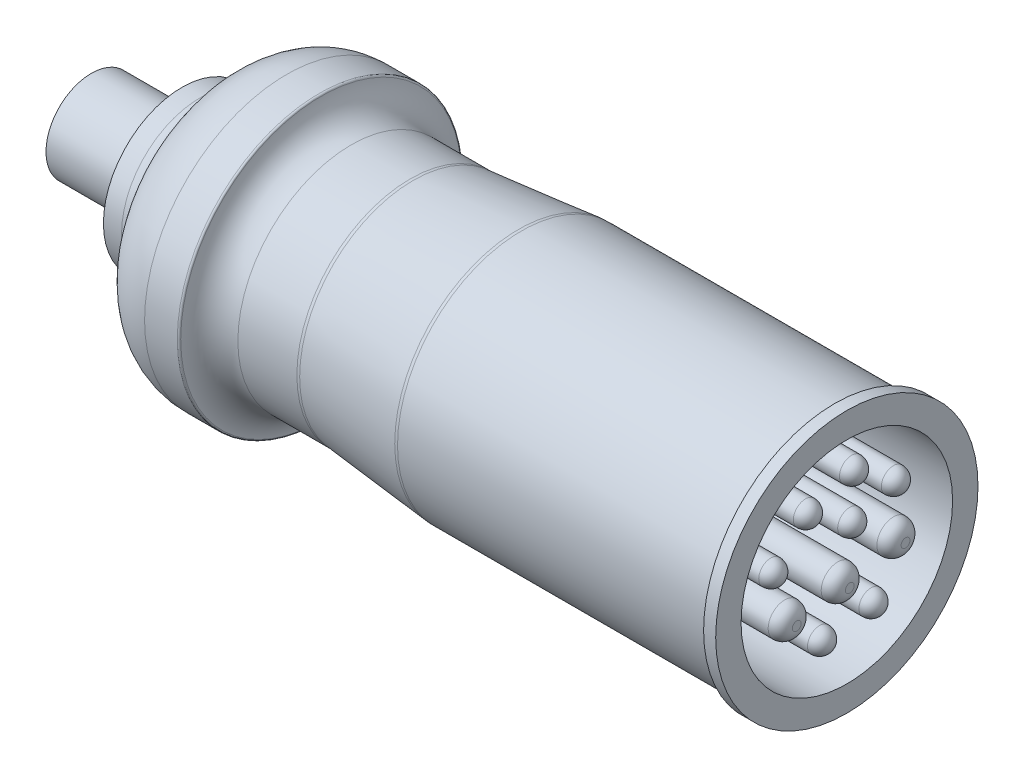
ISO-10303-21;
HEADER;
FILE_DESCRIPTION(('STEP AP214'),'2;1');
FILE_NAME('part.step','',(''),(''),'','','');
FILE_SCHEMA(('AUTOMOTIVE_DESIGN { 1 0 10303 214 1 1 1 1 }'));
ENDSEC;
DATA;
#1=APPLICATION_CONTEXT('core data for automotive mechanical design processes');
#2=APPLICATION_PROTOCOL_DEFINITION('international standard','automotive_design',2000,#1);
#3=PRODUCT_CONTEXT('',#1,'mechanical');
#4=PRODUCT('Part','Part','',(#3));
#5=PRODUCT_RELATED_PRODUCT_CATEGORY('part','',(#4));
#6=PRODUCT_DEFINITION_FORMATION('','',#4);
#7=PRODUCT_DEFINITION_CONTEXT('part definition',#1,'design');
#8=PRODUCT_DEFINITION('design','',#6,#7);
#9=PRODUCT_DEFINITION_SHAPE('','',#8);
#10=(LENGTH_UNIT() NAMED_UNIT(*) SI_UNIT(.MILLI.,.METRE.));
#11=(NAMED_UNIT(*) PLANE_ANGLE_UNIT() SI_UNIT($,.RADIAN.));
#12=(NAMED_UNIT(*) SI_UNIT($,.STERADIAN.) SOLID_ANGLE_UNIT());
#13=UNCERTAINTY_MEASURE_WITH_UNIT(LENGTH_MEASURE(1.E-05),#10,'distance_accuracy_value','');
#14=(GEOMETRIC_REPRESENTATION_CONTEXT(3) GLOBAL_UNCERTAINTY_ASSIGNED_CONTEXT((#13)) GLOBAL_UNIT_ASSIGNED_CONTEXT((#10,
#11,#12)) REPRESENTATION_CONTEXT('',''));
#15=CARTESIAN_POINT('',(0.,0.,0.));
#16=DIRECTION('',(0.,0.,1.));
#17=DIRECTION('',(1.,0.,0.));
#18=AXIS2_PLACEMENT_3D('',#15,#16,#17);
#19=CARTESIAN_POINT('',(0.,0.,0.));
#20=DIRECTION('',(-1.,0.,0.));
#21=DIRECTION('',(0.,0.,1.));
#22=AXIS2_PLACEMENT_3D('',#19,#20,#21);
#23=CYLINDRICAL_SURFACE('',#22,20.5);
#24=CARTESIAN_POINT('',(11.1583612134992,0.,0.));
#25=DIRECTION('',(1.,0.,0.));
#26=DIRECTION('',(0.,0.,-1.));
#27=AXIS2_PLACEMENT_3D('',#24,#25,#26);
#28=CIRCLE('',#27,20.5);
#29=CARTESIAN_POINT('',(11.1583612134992,0.,-20.5));
#30=VERTEX_POINT('',#29);
#31=EDGE_CURVE('E116',#30,#30,#28,.T.);
#32=ORIENTED_EDGE('',*,*,#31,.T.);
#33=EDGE_LOOP('',(#32));
#34=FACE_BOUND('',#33,.T.);
#35=CARTESIAN_POINT('',(63.,0.,0.));
#36=DIRECTION('',(1.,0.,0.));
#37=DIRECTION('',(0.,0.,-1.));
#38=AXIS2_PLACEMENT_3D('',#35,#36,#37);
#39=CIRCLE('',#38,20.5);
#40=CARTESIAN_POINT('',(63.,0.,-20.5));
#41=VERTEX_POINT('',#40);
#42=EDGE_CURVE('E46',#41,#41,#39,.T.);
#43=ORIENTED_EDGE('',*,*,#42,.F.);
#44=EDGE_LOOP('',(#43));
#45=FACE_BOUND('',#44,.T.);
#46=ADVANCED_FACE('F39',(#34,#45),#23,.T.);
#47=CARTESIAN_POINT('',(-45.,13.,0.));
#48=DIRECTION('',(1.,0.,0.));
#49=DIRECTION('',(0.,0.,-1.));
#50=AXIS2_PLACEMENT_3D('',#47,#48,#49);
#51=PLANE('',#50);
#52=CARTESIAN_POINT('',(-45.,0.,0.));
#53=DIRECTION('',(1.,0.,0.));
#54=DIRECTION('',(0.,0.,-1.));
#55=AXIS2_PLACEMENT_3D('',#52,#53,#54);
#56=CIRCLE('',#55,7.5);
#57=CARTESIAN_POINT('',(-45.,0.,-7.5));
#58=VERTEX_POINT('',#57);
#59=EDGE_CURVE('E11',#58,#58,#56,.F.);
#60=ORIENTED_EDGE('',*,*,#59,.F.);
#61=EDGE_LOOP('',(#60));
#62=FACE_BOUND('',#61,.T.);
#63=CARTESIAN_POINT('',(-45.,0.,0.));
#64=DIRECTION('',(-1.,0.,0.));
#65=DIRECTION('',(0.,0.,1.));
#66=AXIS2_PLACEMENT_3D('',#63,#64,#65);
#67=CIRCLE('',#66,13.);
#68=CARTESIAN_POINT('',(-45.,0.,13.));
#69=VERTEX_POINT('',#68);
#70=EDGE_CURVE('E134',#69,#69,#67,.T.);
#71=ORIENTED_EDGE('',*,*,#70,.T.);
#72=EDGE_LOOP('',(#71));
#73=FACE_BOUND('',#72,.T.);
#74=ADVANCED_FACE('F218',(#62,#73),#51,.F.);
#75=CARTESIAN_POINT('',(0.,0.,0.));
#76=DIRECTION('',(-1.,0.,0.));
#77=DIRECTION('',(0.,0.,1.));
#78=AXIS2_PLACEMENT_3D('',#75,#76,#77);
#79=CYLINDRICAL_SURFACE('',#78,13.);
#80=ORIENTED_EDGE('',*,*,#70,.F.);
#81=EDGE_LOOP('',(#80));
#82=FACE_BOUND('',#81,.T.);
#83=CARTESIAN_POINT('',(-42.,0.,0.));
#84=DIRECTION('',(-1.,0.,0.));
#85=DIRECTION('',(0.,0.,1.));
#86=AXIS2_PLACEMENT_3D('',#83,#84,#85);
#87=CIRCLE('',#86,13.);
#88=CARTESIAN_POINT('',(-42.,0.,13.));
#89=VERTEX_POINT('',#88);
#90=EDGE_CURVE('E137',#89,#89,#87,.T.);
#91=ORIENTED_EDGE('',*,*,#90,.T.);
#92=EDGE_LOOP('',(#91));
#93=FACE_BOUND('',#92,.T.);
#94=ADVANCED_FACE('F224',(#82,#93),#79,.T.);
#95=CARTESIAN_POINT('',(-42.,0.,0.));
#96=DIRECTION('',(-1.,0.,0.));
#97=DIRECTION('',(0.,0.,1.));
#98=AXIS2_PLACEMENT_3D('',#95,#96,#97);
#99=TOROIDAL_SURFACE('',#98,17.,4.);
#100=ORIENTED_EDGE('',*,*,#90,.F.);
#101=EDGE_LOOP('',(#100));
#102=FACE_BOUND('',#101,.T.);
#103=CARTESIAN_POINT('',(-38.1842431943322,0.,0.));
#104=DIRECTION('',(-1.,0.,0.));
#105=DIRECTION('',(0.,0.,1.));
#106=AXIS2_PLACEMENT_3D('',#103,#104,#105);
#107=CIRCLE('',#106,15.8);
#108=CARTESIAN_POINT('',(-38.1842431943322,0.,15.8));
#109=VERTEX_POINT('',#108);
#110=EDGE_CURVE('E140',#109,#109,#107,.T.);
#111=ORIENTED_EDGE('',*,*,#110,.T.);
#112=EDGE_LOOP('',(#111));
#113=FACE_BOUND('',#112,.T.);
#114=ADVANCED_FACE('F248',(#102,#113),#99,.F.);
#115=CARTESIAN_POINT('',(-27.6909119787458,0.,0.));
#116=DIRECTION('',(-1.,0.,0.));
#117=DIRECTION('',(0.,0.,1.));
#118=AXIS2_PLACEMENT_3D('',#115,#116,#117);
#119=TOROIDAL_SURFACE('',#118,12.5,11.);
#120=ORIENTED_EDGE('',*,*,#110,.F.);
#121=EDGE_LOOP('',(#120));
#122=FACE_BOUND('',#121,.T.);
#123=CARTESIAN_POINT('',(-27.6909119787458,0.,0.));
#124=DIRECTION('',(-1.,0.,0.));
#125=DIRECTION('',(0.,0.,1.));
#126=AXIS2_PLACEMENT_3D('',#123,#124,#125);
#127=CIRCLE('',#126,23.5);
#128=CARTESIAN_POINT('',(-27.6909119787458,0.,23.5));
#129=VERTEX_POINT('',#128);
#130=EDGE_CURVE('E143',#129,#129,#127,.T.);
#131=ORIENTED_EDGE('',*,*,#130,.T.);
#132=EDGE_LOOP('',(#131));
#133=FACE_BOUND('',#132,.T.);
#134=ADVANCED_FACE('F244',(#122,#133),#119,.T.);
#135=CARTESIAN_POINT('',(0.,0.,0.));
#136=DIRECTION('',(-1.,0.,0.));
#137=DIRECTION('',(0.,0.,1.));
#138=AXIS2_PLACEMENT_3D('',#135,#136,#137);
#139=CYLINDRICAL_SURFACE('',#138,23.5);
#140=CARTESIAN_POINT('',(-22.2776389283821,0.,0.));
#141=DIRECTION('',(1.,0.,0.));
#142=DIRECTION('',(0.,0.,-1.));
#143=AXIS2_PLACEMENT_3D('',#140,#141,#142);
#144=CIRCLE('',#143,23.5);
#145=CARTESIAN_POINT('',(-22.2776389283821,0.,-23.5));
#146=VERTEX_POINT('',#145);
#147=EDGE_CURVE('E128',#146,#146,#144,.F.);
#148=ORIENTED_EDGE('',*,*,#147,.T.);
#149=EDGE_LOOP('',(#148));
#150=FACE_BOUND('',#149,.T.);
#151=ORIENTED_EDGE('',*,*,#130,.F.);
#152=EDGE_LOOP('',(#151));
#153=FACE_BOUND('',#152,.T.);
#154=ADVANCED_FACE('F240',(#150,#153),#139,.T.);
#155=CARTESIAN_POINT('',(0.,0.,0.));
#156=DIRECTION('',(-1.,0.,0.));
#157=DIRECTION('',(0.,0.,1.));
#158=AXIS2_PLACEMENT_3D('',#155,#156,#157);
#159=CYLINDRICAL_SURFACE('',#158,18.75);
#160=CARTESIAN_POINT('',(-7.24363263615247,0.,0.));
#161=DIRECTION('',(-1.,0.,0.));
#162=DIRECTION('',(0.,0.,1.));
#163=AXIS2_PLACEMENT_3D('',#160,#161,#162);
#164=CIRCLE('',#163,18.75);
#165=CARTESIAN_POINT('',(-7.24363263615247,0.,18.75));
#166=VERTEX_POINT('',#165);
#167=EDGE_CURVE('E113',#166,#166,#164,.T.);
#168=ORIENTED_EDGE('',*,*,#167,.T.);
#169=EDGE_LOOP('',(#168));
#170=FACE_BOUND('',#169,.T.);
#171=CARTESIAN_POINT('',(-17.0062539111405,0.,0.));
#172=DIRECTION('',(-1.,0.,0.));
#173=DIRECTION('',(0.,0.,1.));
#174=AXIS2_PLACEMENT_3D('',#171,#172,#173);
#175=CIRCLE('',#174,18.75);
#176=CARTESIAN_POINT('',(-17.0062539111405,0.,18.75));
#177=VERTEX_POINT('',#176);
#178=EDGE_CURVE('E131',#177,#177,#175,.F.);
#179=ORIENTED_EDGE('',*,*,#178,.T.);
#180=EDGE_LOOP('',(#179));
#181=FACE_BOUND('',#180,.T.);
#182=ADVANCED_FACE('F236',(#170,#181),#159,.T.);
#183=CARTESIAN_POINT('',(10.9147285773466,0.,0.));
#184=DIRECTION('',(1.,0.,0.));
#185=DIRECTION('',(0.,0.,-1.));
#186=AXIS2_PLACEMENT_3D('',#183,#184,#185);
#187=CONICAL_SURFACE('',#186,20.5,0.0973760373811173);
#188=CARTESIAN_POINT('',(10.6722501023881,0.,0.));
#189=DIRECTION('',(-1.,0.,0.));
#190=DIRECTION('',(0.,0.,1.));
#191=AXIS2_PLACEMENT_3D('',#188,#189,#190);
#192=CIRCLE('',#191,20.4763134937074);
#193=CARTESIAN_POINT('',(10.6722501023881,0.,20.4763134937074));
#194=VERTEX_POINT('',#193);
#195=EDGE_CURVE('E119',#194,#194,#192,.T.);
#196=ORIENTED_EDGE('',*,*,#195,.T.);
#197=EDGE_LOOP('',(#196));
#198=FACE_BOUND('',#197,.T.);
#199=CARTESIAN_POINT('',(-6.75752152504136,0.,0.));
#200=DIRECTION('',(1.,0.,0.));
#201=DIRECTION('',(0.,0.,-1.));
#202=AXIS2_PLACEMENT_3D('',#199,#200,#201);
#203=CIRCLE('',#202,18.7736865062926);
#204=CARTESIAN_POINT('',(-6.75752152504136,0.,-18.7736865062926));
#205=VERTEX_POINT('',#204);
#206=EDGE_CURVE('E122',#205,#205,#203,.T.);
#207=ORIENTED_EDGE('',*,*,#206,.T.);
#208=EDGE_LOOP('',(#207));
#209=FACE_BOUND('',#208,.T.);
#210=ADVANCED_FACE('F232',(#198,#209),#187,.T.);
#211=CARTESIAN_POINT('',(-17.0062539111405,0.,0.));
#212=DIRECTION('',(-1.,0.,0.));
#213=DIRECTION('',(0.,0.,1.));
#214=AXIS2_PLACEMENT_3D('',#211,#212,#213);
#215=TOROIDAL_SURFACE('',#214,23.75,5.);
#216=CARTESIAN_POINT('',(-21.9792586443877,0.,0.));
#217=DIRECTION('',(1.,0.,0.));
#218=DIRECTION('',(0.,0.,-1.));
#219=AXIS2_PLACEMENT_3D('',#216,#217,#218);
#220=CIRCLE('',#219,23.2311320754717);
#221=CARTESIAN_POINT('',(-21.9792586443877,0.,-23.2311320754717));
#222=VERTEX_POINT('',#221);
#223=EDGE_CURVE('E125',#222,#222,#220,.T.);
#224=ORIENTED_EDGE('',*,*,#223,.T.);
#225=EDGE_LOOP('',(#224));
#226=FACE_BOUND('',#225,.T.);
#227=ORIENTED_EDGE('',*,*,#178,.F.);
#228=EDGE_LOOP('',(#227));
#229=FACE_BOUND('',#228,.T.);
#230=ADVANCED_FACE('F235',(#226,#229),#215,.F.);
#231=CARTESIAN_POINT('',(-22.2776389283821,0.,0.));
#232=DIRECTION('',(1.,0.,0.));
#233=DIRECTION('',(0.,0.,-1.));
#234=AXIS2_PLACEMENT_3D('',#231,#232,#233);
#235=TOROIDAL_SURFACE('',#234,23.2,0.3);
#236=ORIENTED_EDGE('',*,*,#223,.F.);
#237=EDGE_LOOP('',(#236));
#238=FACE_BOUND('',#237,.T.);
#239=ORIENTED_EDGE('',*,*,#147,.F.);
#240=EDGE_LOOP('',(#239));
#241=FACE_BOUND('',#240,.T.);
#242=ADVANCED_FACE('F258',(#238,#241),#235,.T.);
#243=CARTESIAN_POINT('',(11.1583612134992,0.,0.));
#244=DIRECTION('',(1.,0.,0.));
#245=DIRECTION('',(0.,0.,-1.));
#246=AXIS2_PLACEMENT_3D('',#243,#244,#245);
#247=TOROIDAL_SURFACE('',#246,15.5,5.);
#248=ORIENTED_EDGE('',*,*,#31,.F.);
#249=EDGE_LOOP('',(#248));
#250=FACE_BOUND('',#249,.T.);
#251=ORIENTED_EDGE('',*,*,#195,.F.);
#252=EDGE_LOOP('',(#251));
#253=FACE_BOUND('',#252,.T.);
#254=ADVANCED_FACE('F262',(#250,#253),#247,.T.);
#255=CARTESIAN_POINT('',(-7.24363263615247,0.,0.));
#256=DIRECTION('',(-1.,0.,0.));
#257=DIRECTION('',(0.,0.,1.));
#258=AXIS2_PLACEMENT_3D('',#255,#256,#257);
#259=TOROIDAL_SURFACE('',#258,23.75,5.);
#260=ORIENTED_EDGE('',*,*,#206,.F.);
#261=EDGE_LOOP('',(#260));
#262=FACE_BOUND('',#261,.T.);
#263=ORIENTED_EDGE('',*,*,#167,.F.);
#264=EDGE_LOOP('',(#263));
#265=FACE_BOUND('',#264,.T.);
#266=ADVANCED_FACE('F266',(#262,#265),#259,.F.);
#267=CARTESIAN_POINT('',(63.,0.,0.));
#268=DIRECTION('',(1.,0.,0.));
#269=DIRECTION('',(0.,0.,-1.));
#270=AXIS2_PLACEMENT_3D('',#267,#268,#269);
#271=CYLINDRICAL_SURFACE('',#270,21.7);
#272=CARTESIAN_POINT('',(63.,0.,0.));
#273=DIRECTION('',(1.,0.,0.));
#274=DIRECTION('',(0.,0.,-1.));
#275=AXIS2_PLACEMENT_3D('',#272,#273,#274);
#276=CIRCLE('',#275,21.7);
#277=CARTESIAN_POINT('',(63.,0.,-21.7));
#278=VERTEX_POINT('',#277);
#279=EDGE_CURVE('E182',#278,#278,#276,.T.);
#280=ORIENTED_EDGE('',*,*,#279,.T.);
#281=EDGE_LOOP('',(#280));
#282=FACE_BOUND('',#281,.T.);
#283=CARTESIAN_POINT('',(65.,0.,0.));
#284=DIRECTION('',(1.,0.,0.));
#285=DIRECTION('',(0.,0.,-1.));
#286=AXIS2_PLACEMENT_3D('',#283,#284,#285);
#287=CIRCLE('',#286,21.7);
#288=CARTESIAN_POINT('',(65.,0.,-21.7));
#289=VERTEX_POINT('',#288);
#290=EDGE_CURVE('E183',#289,#289,#287,.T.);
#291=ORIENTED_EDGE('',*,*,#290,.F.);
#292=EDGE_LOOP('',(#291));
#293=FACE_BOUND('',#292,.T.);
#294=ADVANCED_FACE('F270',(#282,#293),#271,.T.);
#295=CARTESIAN_POINT('',(63.,0.,0.));
#296=DIRECTION('',(1.,0.,0.));
#297=DIRECTION('',(0.,0.,-1.));
#298=AXIS2_PLACEMENT_3D('',#295,#296,#297);
#299=PLANE('',#298);
#300=ORIENTED_EDGE('',*,*,#42,.T.);
#301=EDGE_LOOP('',(#300));
#302=FACE_BOUND('',#301,.T.);
#303=ORIENTED_EDGE('',*,*,#279,.F.);
#304=EDGE_LOOP('',(#303));
#305=FACE_BOUND('',#304,.T.);
#306=ADVANCED_FACE('F339',(#302,#305),#299,.F.);
#307=CARTESIAN_POINT('',(65.,0.,0.));
#308=DIRECTION('',(-1.,0.,0.));
#309=DIRECTION('',(0.,0.,1.));
#310=AXIS2_PLACEMENT_3D('',#307,#308,#309);
#311=PLANE('',#310);
#312=CARTESIAN_POINT('',(65.,3.56731656131285,-2.48519986218187));
#313=DIRECTION('',(-1.,0.,0.));
#314=DIRECTION('',(0.,0.,1.));
#315=AXIS2_PLACEMENT_3D('',#312,#313,#314);
#316=CIRCLE('',#315,0.000606669885716993);
#317=CARTESIAN_POINT('',(65.,3.56731656131285,-2.48459319229615));
#318=VERTEX_POINT('',#317);
#319=EDGE_CURVE('E71',#318,#318,#316,.F.);
#320=ORIENTED_EDGE('',*,*,#319,.T.);
#321=EDGE_LOOP('',(#320));
#322=FACE_BOUND('',#321,.T.);
#323=ADVANCED_FACE('F345',(#322),#311,.F.);
#324=CARTESIAN_POINT('',(65.,0.,0.));
#325=DIRECTION('',(-1.,0.,0.));
#326=DIRECTION('',(0.,0.,1.));
#327=AXIS2_PLACEMENT_3D('',#324,#325,#326);
#328=PLANE('',#327);
#329=CARTESIAN_POINT('',(65.,10.8693952367516,-2.78447552930021));
#330=DIRECTION('',(-1.,0.,0.));
#331=DIRECTION('',(0.,0.,1.));
#332=AXIS2_PLACEMENT_3D('',#329,#330,#331);
#333=CIRCLE('',#332,0.000606669885715692);
#334=CARTESIAN_POINT('',(65.,10.8693952367516,-2.78386885941449));
#335=VERTEX_POINT('',#334);
#336=EDGE_CURVE('E59',#335,#335,#333,.F.);
#337=ORIENTED_EDGE('',*,*,#336,.T.);
#338=EDGE_LOOP('',(#337));
#339=FACE_BOUND('',#338,.T.);
#340=ADVANCED_FACE('F405',(#339),#328,.F.);
#341=CARTESIAN_POINT('',(65.,0.,0.));
#342=DIRECTION('',(-1.,0.,0.));
#343=DIRECTION('',(0.,0.,1.));
#344=AXIS2_PLACEMENT_3D('',#341,#342,#343);
#345=PLANE('',#344);
#346=CARTESIAN_POINT('',(65.,8.44417520421064,4.84394384578304));
#347=DIRECTION('',(-1.,0.,0.));
#348=DIRECTION('',(0.,0.,1.));
#349=AXIS2_PLACEMENT_3D('',#346,#347,#348);
#350=CIRCLE('',#349,0.000606669885717427);
#351=CARTESIAN_POINT('',(65.,8.44417520421064,4.84455051566875));
#352=VERTEX_POINT('',#351);
#353=EDGE_CURVE('E50',#352,#352,#350,.F.);
#354=ORIENTED_EDGE('',*,*,#353,.T.);
#355=EDGE_LOOP('',(#354));
#356=FACE_BOUND('',#355,.T.);
#357=ADVANCED_FACE('F398',(#356),#345,.F.);
#358=CARTESIAN_POINT('',(65.,0.,0.));
#359=DIRECTION('',(-1.,0.,0.));
#360=DIRECTION('',(0.,0.,1.));
#361=AXIS2_PLACEMENT_3D('',#358,#359,#360);
#362=PLANE('',#361);
#363=CARTESIAN_POINT('',(65.,2.84412167452525,10.5762821045161));
#364=DIRECTION('',(-1.,0.,0.));
#365=DIRECTION('',(0.,0.,1.));
#366=AXIS2_PLACEMENT_3D('',#363,#364,#365);
#367=CIRCLE('',#366,0.00060666988571656);
#368=CARTESIAN_POINT('',(65.,2.84412167452525,10.5768887744018));
#369=VERTEX_POINT('',#368);
#370=EDGE_CURVE('E77',#369,#369,#367,.F.);
#371=ORIENTED_EDGE('',*,*,#370,.T.);
#372=EDGE_LOOP('',(#371));
#373=FACE_BOUND('',#372,.T.);
#374=ADVANCED_FACE('F390',(#373),#362,.F.);
#375=CARTESIAN_POINT('',(65.,0.,0.));
#376=DIRECTION('',(-1.,0.,0.));
#377=DIRECTION('',(0.,0.,1.));
#378=AXIS2_PLACEMENT_3D('',#375,#376,#377);
#379=PLANE('',#378);
#380=CARTESIAN_POINT('',(65.,5.9307653523046,-9.70737634946245));
#381=DIRECTION('',(-1.,0.,0.));
#382=DIRECTION('',(0.,0.,1.));
#383=AXIS2_PLACEMENT_3D('',#380,#381,#382);
#384=CIRCLE('',#383,0.00060666988571656);
#385=CARTESIAN_POINT('',(65.,5.9307653523046,-9.70676967957674));
#386=VERTEX_POINT('',#385);
#387=EDGE_CURVE('E65',#386,#386,#384,.F.);
#388=ORIENTED_EDGE('',*,*,#387,.T.);
#389=EDGE_LOOP('',(#388));
#390=FACE_BOUND('',#389,.T.);
#391=ADVANCED_FACE('F382',(#390),#379,.F.);
#392=CARTESIAN_POINT('',(65.,0.,0.));
#393=DIRECTION('',(-1.,0.,0.));
#394=DIRECTION('',(0.,0.,1.));
#395=AXIS2_PLACEMENT_3D('',#392,#393,#394);
#396=PLANE('',#395);
#397=CARTESIAN_POINT('',(65.,-10.8693952367516,2.50691363260725));
#398=DIRECTION('',(-1.,0.,0.));
#399=DIRECTION('',(0.,0.,1.));
#400=AXIS2_PLACEMENT_3D('',#397,#398,#399);
#401=CIRCLE('',#400,0.000606669885717427);
#402=CARTESIAN_POINT('',(65.,-10.8693952367516,2.50752030249297));
#403=VERTEX_POINT('',#402);
#404=EDGE_CURVE('E107',#403,#403,#401,.F.);
#405=ORIENTED_EDGE('',*,*,#404,.T.);
#406=EDGE_LOOP('',(#405));
#407=FACE_BOUND('',#406,.T.);
#408=ADVANCED_FACE('F374',(#407),#396,.F.);
#409=CARTESIAN_POINT('',(65.,0.,0.));
#410=DIRECTION('',(-1.,0.,0.));
#411=DIRECTION('',(0.,0.,1.));
#412=AXIS2_PLACEMENT_3D('',#409,#410,#411);
#413=PLANE('',#412);
#414=CARTESIAN_POINT('',(65.,-9.72292758500494,-6.00340393612724));
#415=DIRECTION('',(-1.,0.,0.));
#416=DIRECTION('',(0.,0.,1.));
#417=AXIS2_PLACEMENT_3D('',#414,#415,#416);
#418=CIRCLE('',#417,0.000606669885717427);
#419=CARTESIAN_POINT('',(65.,-9.72292758500494,-6.00279726624152));
#420=VERTEX_POINT('',#419);
#421=EDGE_CURVE('E101',#420,#420,#418,.F.);
#422=ORIENTED_EDGE('',*,*,#421,.T.);
#423=EDGE_LOOP('',(#422));
#424=FACE_BOUND('',#423,.T.);
#425=ADVANCED_FACE('F366',(#424),#413,.F.);
#426=CARTESIAN_POINT('',(65.,0.,0.));
#427=DIRECTION('',(-1.,0.,0.));
#428=DIRECTION('',(0.,0.,1.));
#429=AXIS2_PLACEMENT_3D('',#426,#427,#428);
#430=PLANE('',#429);
#431=CARTESIAN_POINT('',(65.,-2.13860311960426,-9.70737634946245));
#432=DIRECTION('',(-1.,0.,0.));
#433=DIRECTION('',(0.,0.,1.));
#434=AXIS2_PLACEMENT_3D('',#431,#432,#433);
#435=CIRCLE('',#434,0.733173099565215);
#436=CARTESIAN_POINT('',(65.,-2.13860311960426,-8.97420324989724));
#437=VERTEX_POINT('',#436);
#438=EDGE_CURVE('E95',#437,#437,#435,.F.);
#439=ORIENTED_EDGE('',*,*,#438,.T.);
#440=EDGE_LOOP('',(#439));
#441=FACE_BOUND('',#440,.T.);
#442=ADVANCED_FACE('F358',(#441),#430,.F.);
#443=CARTESIAN_POINT('',(65.,0.,0.));
#444=DIRECTION('',(-1.,0.,0.));
#445=DIRECTION('',(0.,0.,1.));
#446=AXIS2_PLACEMENT_3D('',#443,#444,#445);
#447=PLANE('',#446);
#448=CARTESIAN_POINT('',(65.,-3.99058932627187,-0.491540225806979));
#449=DIRECTION('',(-1.,0.,0.));
#450=DIRECTION('',(0.,0.,1.));
#451=AXIS2_PLACEMENT_3D('',#448,#449,#450);
#452=CIRCLE('',#451,0.733173099565215);
#453=CARTESIAN_POINT('',(65.,-3.99058932627187,0.241632873758237));
#454=VERTEX_POINT('',#453);
#455=EDGE_CURVE('E89',#454,#454,#452,.F.);
#456=ORIENTED_EDGE('',*,*,#455,.T.);
#457=EDGE_LOOP('',(#456));
#458=FACE_BOUND('',#457,.T.);
#459=ADVANCED_FACE('F350',(#458),#447,.F.);
#460=CARTESIAN_POINT('',(65.,0.,0.));
#461=DIRECTION('',(-1.,0.,0.));
#462=DIRECTION('',(0.,0.,1.));
#463=AXIS2_PLACEMENT_3D('',#460,#461,#462);
#464=PLANE('',#463);
#465=CARTESIAN_POINT('',(65.,-5.04886715865336,8.28334680102288));
#466=DIRECTION('',(-1.,0.,0.));
#467=DIRECTION('',(0.,0.,1.));
#468=AXIS2_PLACEMENT_3D('',#465,#466,#467);
#469=CIRCLE('',#468,0.733173099565215);
#470=CARTESIAN_POINT('',(65.,-5.04886715865336,9.0165199005881));
#471=VERTEX_POINT('',#470);
#472=EDGE_CURVE('E83',#471,#471,#469,.F.);
#473=ORIENTED_EDGE('',*,*,#472,.T.);
#474=EDGE_LOOP('',(#473));
#475=FACE_BOUND('',#474,.T.);
#476=ADVANCED_FACE('F302',(#475),#464,.F.);
#477=CARTESIAN_POINT('',(63.,3.56731656131285,-2.48519986218187));
#478=DIRECTION('',(-1.,0.,0.));
#479=DIRECTION('',(0.,0.,1.));
#480=AXIS2_PLACEMENT_3D('',#477,#478,#479);
#481=DEGENERATE_TOROIDAL_SURFACE('',#480,0.000606669885716993,2.,.T.);
#482=ORIENTED_EDGE('',*,*,#319,.F.);
#483=EDGE_LOOP('',(#482));
#484=FACE_BOUND('',#483,.T.);
#485=CARTESIAN_POINT('',(63.,3.56731656131285,-2.48519986218187));
#486=DIRECTION('',(-1.,0.,0.));
#487=DIRECTION('',(0.,0.,1.));
#488=AXIS2_PLACEMENT_3D('',#485,#486,#487);
#489=CIRCLE('',#488,2.00060666988572);
#490=CARTESIAN_POINT('',(63.,3.56731656131285,-0.484593192296154));
#491=VERTEX_POINT('',#490);
#492=EDGE_CURVE('E74',#491,#491,#489,.T.);
#493=ORIENTED_EDGE('',*,*,#492,.F.);
#494=EDGE_LOOP('',(#493));
#495=FACE_BOUND('',#494,.T.);
#496=ADVANCED_FACE('F298',(#484,#495),#481,.T.);
#497=CARTESIAN_POINT('',(63.,10.8693952367516,-2.78447552930021));
#498=DIRECTION('',(-1.,0.,0.));
#499=DIRECTION('',(0.,0.,1.));
#500=AXIS2_PLACEMENT_3D('',#497,#498,#499);
#501=DEGENERATE_TOROIDAL_SURFACE('',#500,0.000606669885715692,2.,.T.);
#502=ORIENTED_EDGE('',*,*,#336,.F.);
#503=EDGE_LOOP('',(#502));
#504=FACE_BOUND('',#503,.T.);
#505=CARTESIAN_POINT('',(63.,10.8693952367516,-2.78447552930021));
#506=DIRECTION('',(-1.,0.,0.));
#507=DIRECTION('',(0.,0.,1.));
#508=AXIS2_PLACEMENT_3D('',#505,#506,#507);
#509=CIRCLE('',#508,2.00060666988572);
#510=CARTESIAN_POINT('',(63.,10.8693952367516,-0.783868859414489));
#511=VERTEX_POINT('',#510);
#512=EDGE_CURVE('E62',#511,#511,#509,.T.);
#513=ORIENTED_EDGE('',*,*,#512,.F.);
#514=EDGE_LOOP('',(#513));
#515=FACE_BOUND('',#514,.T.);
#516=ADVANCED_FACE('F301',(#504,#515),#501,.T.);
#517=CARTESIAN_POINT('',(63.,8.44417520421064,4.84394384578304));
#518=DIRECTION('',(-1.,0.,0.));
#519=DIRECTION('',(0.,0.,1.));
#520=AXIS2_PLACEMENT_3D('',#517,#518,#519);
#521=DEGENERATE_TOROIDAL_SURFACE('',#520,0.000606669885717427,2.,.T.);
#522=ORIENTED_EDGE('',*,*,#353,.F.);
#523=EDGE_LOOP('',(#522));
#524=FACE_BOUND('',#523,.T.);
#525=CARTESIAN_POINT('',(63.,8.44417520421064,4.84394384578304));
#526=DIRECTION('',(-1.,0.,0.));
#527=DIRECTION('',(0.,0.,1.));
#528=AXIS2_PLACEMENT_3D('',#525,#526,#527);
#529=CIRCLE('',#528,2.00060666988572);
#530=CARTESIAN_POINT('',(63.,8.44417520421064,6.84455051566875));
#531=VERTEX_POINT('',#530);
#532=EDGE_CURVE('E54',#531,#531,#529,.T.);
#533=ORIENTED_EDGE('',*,*,#532,.F.);
#534=EDGE_LOOP('',(#533));
#535=FACE_BOUND('',#534,.T.);
#536=ADVANCED_FACE('F41',(#524,#535),#521,.T.);
#537=CARTESIAN_POINT('',(63.,2.84412167452525,10.5762821045161));
#538=DIRECTION('',(-1.,0.,0.));
#539=DIRECTION('',(0.,0.,1.));
#540=AXIS2_PLACEMENT_3D('',#537,#538,#539);
#541=DEGENERATE_TOROIDAL_SURFACE('',#540,0.00060666988571656,2.,.T.);
#542=ORIENTED_EDGE('',*,*,#370,.F.);
#543=EDGE_LOOP('',(#542));
#544=FACE_BOUND('',#543,.T.);
#545=CARTESIAN_POINT('',(63.,2.84412167452525,10.5762821045161));
#546=DIRECTION('',(-1.,0.,0.));
#547=DIRECTION('',(0.,0.,1.));
#548=AXIS2_PLACEMENT_3D('',#545,#546,#547);
#549=CIRCLE('',#548,2.00060666988572);
#550=CARTESIAN_POINT('',(63.,2.84412167452525,12.5768887744018));
#551=VERTEX_POINT('',#550);
#552=EDGE_CURVE('E80',#551,#551,#549,.T.);
#553=ORIENTED_EDGE('',*,*,#552,.F.);
#554=EDGE_LOOP('',(#553));
#555=FACE_BOUND('',#554,.T.);
#556=ADVANCED_FACE('F294',(#544,#555),#541,.T.);
#557=CARTESIAN_POINT('',(63.,5.9307653523046,-9.70737634946245));
#558=DIRECTION('',(-1.,0.,0.));
#559=DIRECTION('',(0.,0.,1.));
#560=AXIS2_PLACEMENT_3D('',#557,#558,#559);
#561=DEGENERATE_TOROIDAL_SURFACE('',#560,0.00060666988571656,2.,.T.);
#562=ORIENTED_EDGE('',*,*,#387,.F.);
#563=EDGE_LOOP('',(#562));
#564=FACE_BOUND('',#563,.T.);
#565=CARTESIAN_POINT('',(63.,5.9307653523046,-9.70737634946245));
#566=DIRECTION('',(-1.,0.,0.));
#567=DIRECTION('',(0.,0.,1.));
#568=AXIS2_PLACEMENT_3D('',#565,#566,#567);
#569=CIRCLE('',#568,2.00060666988572);
#570=CARTESIAN_POINT('',(63.,5.9307653523046,-7.70676967957674));
#571=VERTEX_POINT('',#570);
#572=EDGE_CURVE('E68',#571,#571,#569,.T.);
#573=ORIENTED_EDGE('',*,*,#572,.F.);
#574=EDGE_LOOP('',(#573));
#575=FACE_BOUND('',#574,.T.);
#576=ADVANCED_FACE('F276',(#564,#575),#561,.T.);
#577=CARTESIAN_POINT('',(63.,-10.8693952367516,2.50691363260725));
#578=DIRECTION('',(-1.,0.,0.));
#579=DIRECTION('',(0.,0.,1.));
#580=AXIS2_PLACEMENT_3D('',#577,#578,#579);
#581=DEGENERATE_TOROIDAL_SURFACE('',#580,0.000606669885717427,2.,.T.);
#582=ORIENTED_EDGE('',*,*,#404,.F.);
#583=EDGE_LOOP('',(#582));
#584=FACE_BOUND('',#583,.T.);
#585=CARTESIAN_POINT('',(63.,-10.8693952367516,2.50691363260725));
#586=DIRECTION('',(-1.,0.,0.));
#587=DIRECTION('',(0.,0.,1.));
#588=AXIS2_PLACEMENT_3D('',#585,#586,#587);
#589=CIRCLE('',#588,2.00060666988572);
#590=CARTESIAN_POINT('',(63.,-10.8693952367516,4.50752030249297));
#591=VERTEX_POINT('',#590);
#592=EDGE_CURVE('E110',#591,#591,#589,.T.);
#593=ORIENTED_EDGE('',*,*,#592,.F.);
#594=EDGE_LOOP('',(#593));
#595=FACE_BOUND('',#594,.T.);
#596=ADVANCED_FACE('F272',(#584,#595),#581,.T.);
#597=CARTESIAN_POINT('',(63.,-9.72292758500494,-6.00340393612724));
#598=DIRECTION('',(-1.,0.,0.));
#599=DIRECTION('',(0.,0.,1.));
#600=AXIS2_PLACEMENT_3D('',#597,#598,#599);
#601=DEGENERATE_TOROIDAL_SURFACE('',#600,0.000606669885717427,2.,.T.);
#602=ORIENTED_EDGE('',*,*,#421,.F.);
#603=EDGE_LOOP('',(#602));
#604=FACE_BOUND('',#603,.T.);
#605=CARTESIAN_POINT('',(63.,-9.72292758500494,-6.00340393612724));
#606=DIRECTION('',(-1.,0.,0.));
#607=DIRECTION('',(0.,0.,1.));
#608=AXIS2_PLACEMENT_3D('',#605,#606,#607);
#609=CIRCLE('',#608,2.00060666988572);
#610=CARTESIAN_POINT('',(63.,-9.72292758500494,-4.00279726624152));
#611=VERTEX_POINT('',#610);
#612=EDGE_CURVE('E104',#611,#611,#609,.T.);
#613=ORIENTED_EDGE('',*,*,#612,.F.);
#614=EDGE_LOOP('',(#613));
#615=FACE_BOUND('',#614,.T.);
#616=ADVANCED_FACE('F275',(#604,#615),#601,.T.);
#617=CARTESIAN_POINT('',(63.,-2.13860311960426,-9.70737634946245));
#618=DIRECTION('',(-1.,0.,0.));
#619=DIRECTION('',(0.,0.,1.));
#620=AXIS2_PLACEMENT_3D('',#617,#618,#619);
#621=DEGENERATE_TOROIDAL_SURFACE('',#620,0.733173099565215,2.,.T.);
#622=ORIENTED_EDGE('',*,*,#438,.F.);
#623=EDGE_LOOP('',(#622));
#624=FACE_BOUND('',#623,.T.);
#625=CARTESIAN_POINT('',(63.,-2.13860311960426,-9.70737634946245));
#626=DIRECTION('',(-1.,0.,0.));
#627=DIRECTION('',(0.,0.,1.));
#628=AXIS2_PLACEMENT_3D('',#625,#626,#627);
#629=CIRCLE('',#628,2.73317309956522);
#630=CARTESIAN_POINT('',(63.,-2.13860311960426,-6.97420324989724));
#631=VERTEX_POINT('',#630);
#632=EDGE_CURVE('E98',#631,#631,#629,.T.);
#633=ORIENTED_EDGE('',*,*,#632,.F.);
#634=EDGE_LOOP('',(#633));
#635=FACE_BOUND('',#634,.T.);
#636=ADVANCED_FACE('F280',(#624,#635),#621,.T.);
#637=CARTESIAN_POINT('',(63.,-3.99058932627187,-0.491540225806979));
#638=DIRECTION('',(-1.,0.,0.));
#639=DIRECTION('',(0.,0.,1.));
#640=AXIS2_PLACEMENT_3D('',#637,#638,#639);
#641=DEGENERATE_TOROIDAL_SURFACE('',#640,0.733173099565215,2.,.T.);
#642=ORIENTED_EDGE('',*,*,#455,.F.);
#643=EDGE_LOOP('',(#642));
#644=FACE_BOUND('',#643,.T.);
#645=CARTESIAN_POINT('',(63.,-3.99058932627187,-0.491540225806979));
#646=DIRECTION('',(-1.,0.,0.));
#647=DIRECTION('',(0.,0.,1.));
#648=AXIS2_PLACEMENT_3D('',#645,#646,#647);
#649=CIRCLE('',#648,2.73317309956522);
#650=CARTESIAN_POINT('',(63.,-3.99058932627187,2.24163287375824));
#651=VERTEX_POINT('',#650);
#652=EDGE_CURVE('E92',#651,#651,#649,.T.);
#653=ORIENTED_EDGE('',*,*,#652,.F.);
#654=EDGE_LOOP('',(#653));
#655=FACE_BOUND('',#654,.T.);
#656=ADVANCED_FACE('F284',(#644,#655),#641,.T.);
#657=CARTESIAN_POINT('',(63.,-5.04886715865336,8.28334680102288));
#658=DIRECTION('',(-1.,0.,0.));
#659=DIRECTION('',(0.,0.,1.));
#660=AXIS2_PLACEMENT_3D('',#657,#658,#659);
#661=DEGENERATE_TOROIDAL_SURFACE('',#660,0.733173099565215,2.,.T.);
#662=ORIENTED_EDGE('',*,*,#472,.F.);
#663=EDGE_LOOP('',(#662));
#664=FACE_BOUND('',#663,.T.);
#665=CARTESIAN_POINT('',(63.,-5.04886715865336,8.28334680102288));
#666=DIRECTION('',(-1.,0.,0.));
#667=DIRECTION('',(0.,0.,1.));
#668=AXIS2_PLACEMENT_3D('',#665,#666,#667);
#669=CIRCLE('',#668,2.73317309956522);
#670=CARTESIAN_POINT('',(63.,-5.04886715865336,11.0165199005881));
#671=VERTEX_POINT('',#670);
#672=EDGE_CURVE('E86',#671,#671,#669,.T.);
#673=ORIENTED_EDGE('',*,*,#672,.F.);
#674=EDGE_LOOP('',(#673));
#675=FACE_BOUND('',#674,.T.);
#676=ADVANCED_FACE('F288',(#664,#675),#661,.T.);
#677=CARTESIAN_POINT('',(72.7305809314369,3.56731656131285,-2.48519986218187));
#678=DIRECTION('',(-1.,0.,0.));
#679=DIRECTION('',(0.,0.,1.));
#680=AXIS2_PLACEMENT_3D('',#677,#678,#679);
#681=CYLINDRICAL_SURFACE('',#680,2.00060666988572);
#682=ORIENTED_EDGE('',*,*,#492,.T.);
#683=EDGE_LOOP('',(#682));
#684=FACE_BOUND('',#683,.T.);
#685=CARTESIAN_POINT('',(30.,3.56731656131285,-2.48519986218187));
#686=DIRECTION('',(1.,0.,0.));
#687=DIRECTION('',(0.,0.,-1.));
#688=AXIS2_PLACEMENT_3D('',#685,#686,#687);
#689=CIRCLE('',#688,2.00060666988572);
#690=CARTESIAN_POINT('',(30.,3.56731656131285,-4.48580653206759));
#691=VERTEX_POINT('',#690);
#692=EDGE_CURVE('E150',#691,#691,#689,.T.);
#693=ORIENTED_EDGE('',*,*,#692,.T.);
#694=EDGE_LOOP('',(#693));
#695=FACE_BOUND('',#694,.T.);
#696=ADVANCED_FACE('F292',(#684,#695),#681,.T.);
#697=CARTESIAN_POINT('',(72.7305809314369,10.8693952367516,-2.78447552930021));
#698=DIRECTION('',(-1.,0.,0.));
#699=DIRECTION('',(0.,0.,1.));
#700=AXIS2_PLACEMENT_3D('',#697,#698,#699);
#701=CYLINDRICAL_SURFACE('',#700,2.00060666988572);
#702=ORIENTED_EDGE('',*,*,#512,.T.);
#703=EDGE_LOOP('',(#702));
#704=FACE_BOUND('',#703,.T.);
#705=CARTESIAN_POINT('',(30.,10.8693952367516,-2.78447552930021));
#706=DIRECTION('',(1.,0.,0.));
#707=DIRECTION('',(0.,0.,-1.));
#708=AXIS2_PLACEMENT_3D('',#705,#706,#707);
#709=CIRCLE('',#708,2.00060666988572);
#710=CARTESIAN_POINT('',(30.,10.8693952367516,-4.78508219918592));
#711=VERTEX_POINT('',#710);
#712=EDGE_CURVE('E155',#711,#711,#709,.T.);
#713=ORIENTED_EDGE('',*,*,#712,.T.);
#714=EDGE_LOOP('',(#713));
#715=FACE_BOUND('',#714,.T.);
#716=ADVANCED_FACE('F316',(#704,#715),#701,.T.);
#717=CARTESIAN_POINT('',(72.7305809314369,8.44417520421064,4.84394384578304));
#718=DIRECTION('',(-1.,0.,0.));
#719=DIRECTION('',(0.,0.,1.));
#720=AXIS2_PLACEMENT_3D('',#717,#718,#719);
#721=CYLINDRICAL_SURFACE('',#720,2.00060666988572);
#722=ORIENTED_EDGE('',*,*,#532,.T.);
#723=EDGE_LOOP('',(#722));
#724=FACE_BOUND('',#723,.T.);
#725=CARTESIAN_POINT('',(30.,8.44417520421064,4.84394384578304));
#726=DIRECTION('',(1.,0.,0.));
#727=DIRECTION('',(0.,0.,-1.));
#728=AXIS2_PLACEMENT_3D('',#725,#726,#727);
#729=CIRCLE('',#728,2.00060666988572);
#730=CARTESIAN_POINT('',(30.,8.44417520421064,2.84333717589732));
#731=VERTEX_POINT('',#730);
#732=EDGE_CURVE('E158',#731,#731,#729,.T.);
#733=ORIENTED_EDGE('',*,*,#732,.T.);
#734=EDGE_LOOP('',(#733));
#735=FACE_BOUND('',#734,.T.);
#736=ADVANCED_FACE('F319',(#724,#735),#721,.T.);
#737=CARTESIAN_POINT('',(72.7305809314369,2.84412167452525,10.5762821045161));
#738=DIRECTION('',(-1.,0.,0.));
#739=DIRECTION('',(0.,0.,1.));
#740=AXIS2_PLACEMENT_3D('',#737,#738,#739);
#741=CYLINDRICAL_SURFACE('',#740,2.00060666988572);
#742=ORIENTED_EDGE('',*,*,#552,.T.);
#743=EDGE_LOOP('',(#742));
#744=FACE_BOUND('',#743,.T.);
#745=CARTESIAN_POINT('',(30.,2.84412167452525,10.5762821045161));
#746=DIRECTION('',(1.,0.,0.));
#747=DIRECTION('',(0.,0.,-1.));
#748=AXIS2_PLACEMENT_3D('',#745,#746,#747);
#749=CIRCLE('',#748,2.00060666988572);
#750=CARTESIAN_POINT('',(30.,2.84412167452525,8.57567543463039));
#751=VERTEX_POINT('',#750);
#752=EDGE_CURVE('E161',#751,#751,#749,.T.);
#753=ORIENTED_EDGE('',*,*,#752,.T.);
#754=EDGE_LOOP('',(#753));
#755=FACE_BOUND('',#754,.T.);
#756=ADVANCED_FACE('F394',(#744,#755),#741,.T.);
#757=CARTESIAN_POINT('',(72.7305809314369,5.9307653523046,-9.70737634946245));
#758=DIRECTION('',(-1.,0.,0.));
#759=DIRECTION('',(0.,0.,1.));
#760=AXIS2_PLACEMENT_3D('',#757,#758,#759);
#761=CYLINDRICAL_SURFACE('',#760,2.00060666988572);
#762=ORIENTED_EDGE('',*,*,#572,.T.);
#763=EDGE_LOOP('',(#762));
#764=FACE_BOUND('',#763,.T.);
#765=CARTESIAN_POINT('',(30.,5.9307653523046,-9.70737634946245));
#766=DIRECTION('',(1.,0.,0.));
#767=DIRECTION('',(0.,0.,-1.));
#768=AXIS2_PLACEMENT_3D('',#765,#766,#767);
#769=CIRCLE('',#768,2.00060666988572);
#770=CARTESIAN_POINT('',(30.,5.9307653523046,-11.7079830193482));
#771=VERTEX_POINT('',#770);
#772=EDGE_CURVE('E164',#771,#771,#769,.T.);
#773=ORIENTED_EDGE('',*,*,#772,.T.);
#774=EDGE_LOOP('',(#773));
#775=FACE_BOUND('',#774,.T.);
#776=ADVANCED_FACE('F386',(#764,#775),#761,.T.);
#777=CARTESIAN_POINT('',(72.7305809314369,-10.8693952367516,2.50691363260725));
#778=DIRECTION('',(-1.,0.,0.));
#779=DIRECTION('',(0.,0.,1.));
#780=AXIS2_PLACEMENT_3D('',#777,#778,#779);
#781=CYLINDRICAL_SURFACE('',#780,2.00060666988572);
#782=ORIENTED_EDGE('',*,*,#592,.T.);
#783=EDGE_LOOP('',(#782));
#784=FACE_BOUND('',#783,.T.);
#785=CARTESIAN_POINT('',(30.,-10.8693952367516,2.50691363260725));
#786=DIRECTION('',(1.,0.,0.));
#787=DIRECTION('',(0.,0.,-1.));
#788=AXIS2_PLACEMENT_3D('',#785,#786,#787);
#789=CIRCLE('',#788,2.00060666988572);
#790=CARTESIAN_POINT('',(30.,-10.8693952367516,0.506306962721531));
#791=VERTEX_POINT('',#790);
#792=EDGE_CURVE('E167',#791,#791,#789,.T.);
#793=ORIENTED_EDGE('',*,*,#792,.T.);
#794=EDGE_LOOP('',(#793));
#795=FACE_BOUND('',#794,.T.);
#796=ADVANCED_FACE('F378',(#784,#795),#781,.T.);
#797=CARTESIAN_POINT('',(72.7305809314369,-9.72292758500494,-6.00340393612724));
#798=DIRECTION('',(-1.,0.,0.));
#799=DIRECTION('',(0.,0.,1.));
#800=AXIS2_PLACEMENT_3D('',#797,#798,#799);
#801=CYLINDRICAL_SURFACE('',#800,2.00060666988572);
#802=ORIENTED_EDGE('',*,*,#612,.T.);
#803=EDGE_LOOP('',(#802));
#804=FACE_BOUND('',#803,.T.);
#805=CARTESIAN_POINT('',(30.,-9.72292758500494,-6.00340393612724));
#806=DIRECTION('',(1.,0.,0.));
#807=DIRECTION('',(0.,0.,-1.));
#808=AXIS2_PLACEMENT_3D('',#805,#806,#807);
#809=CIRCLE('',#808,2.00060666988572);
#810=CARTESIAN_POINT('',(30.,-9.72292758500494,-8.00401060601296));
#811=VERTEX_POINT('',#810);
#812=EDGE_CURVE('E170',#811,#811,#809,.T.);
#813=ORIENTED_EDGE('',*,*,#812,.T.);
#814=EDGE_LOOP('',(#813));
#815=FACE_BOUND('',#814,.T.);
#816=ADVANCED_FACE('F370',(#804,#815),#801,.T.);
#817=CARTESIAN_POINT('',(72.7305809314369,-2.13860311960426,-9.70737634946245));
#818=DIRECTION('',(-1.,0.,0.));
#819=DIRECTION('',(0.,0.,1.));
#820=AXIS2_PLACEMENT_3D('',#817,#818,#819);
#821=CYLINDRICAL_SURFACE('',#820,2.73317309956522);
#822=ORIENTED_EDGE('',*,*,#632,.T.);
#823=EDGE_LOOP('',(#822));
#824=FACE_BOUND('',#823,.T.);
#825=CARTESIAN_POINT('',(30.,-2.13860311960426,-9.70737634946245));
#826=DIRECTION('',(1.,0.,0.));
#827=DIRECTION('',(0.,0.,-1.));
#828=AXIS2_PLACEMENT_3D('',#825,#826,#827);
#829=CIRCLE('',#828,2.73317309956522);
#830=CARTESIAN_POINT('',(30.,-2.13860311960426,-12.4405494490277));
#831=VERTEX_POINT('',#830);
#832=EDGE_CURVE('E173',#831,#831,#829,.T.);
#833=ORIENTED_EDGE('',*,*,#832,.T.);
#834=EDGE_LOOP('',(#833));
#835=FACE_BOUND('',#834,.T.);
#836=ADVANCED_FACE('F362',(#824,#835),#821,.T.);
#837=CARTESIAN_POINT('',(72.7305809314369,-3.99058932627187,-0.491540225806979));
#838=DIRECTION('',(-1.,0.,0.));
#839=DIRECTION('',(0.,0.,1.));
#840=AXIS2_PLACEMENT_3D('',#837,#838,#839);
#841=CYLINDRICAL_SURFACE('',#840,2.73317309956522);
#842=ORIENTED_EDGE('',*,*,#652,.T.);
#843=EDGE_LOOP('',(#842));
#844=FACE_BOUND('',#843,.T.);
#845=CARTESIAN_POINT('',(30.,-3.99058932627187,-0.491540225806979));
#846=DIRECTION('',(1.,0.,0.));
#847=DIRECTION('',(0.,0.,-1.));
#848=AXIS2_PLACEMENT_3D('',#845,#846,#847);
#849=CIRCLE('',#848,2.73317309956522);
#850=CARTESIAN_POINT('',(30.,-3.99058932627187,-3.22471332537219));
#851=VERTEX_POINT('',#850);
#852=EDGE_CURVE('E176',#851,#851,#849,.T.);
#853=ORIENTED_EDGE('',*,*,#852,.T.);
#854=EDGE_LOOP('',(#853));
#855=FACE_BOUND('',#854,.T.);
#856=ADVANCED_FACE('F354',(#844,#855),#841,.T.);
#857=CARTESIAN_POINT('',(72.7305809314369,-5.04886715865336,8.28334680102288));
#858=DIRECTION('',(-1.,0.,0.));
#859=DIRECTION('',(0.,0.,1.));
#860=AXIS2_PLACEMENT_3D('',#857,#858,#859);
#861=CYLINDRICAL_SURFACE('',#860,2.73317309956522);
#862=ORIENTED_EDGE('',*,*,#672,.T.);
#863=EDGE_LOOP('',(#862));
#864=FACE_BOUND('',#863,.T.);
#865=CARTESIAN_POINT('',(30.,-5.04886715865336,8.28334680102288));
#866=DIRECTION('',(1.,0.,0.));
#867=DIRECTION('',(0.,0.,-1.));
#868=AXIS2_PLACEMENT_3D('',#865,#866,#867);
#869=CIRCLE('',#868,2.73317309956522);
#870=CARTESIAN_POINT('',(30.,-5.04886715865336,5.55017370145766));
#871=VERTEX_POINT('',#870);
#872=EDGE_CURVE('E179',#871,#871,#869,.T.);
#873=ORIENTED_EDGE('',*,*,#872,.T.);
#874=EDGE_LOOP('',(#873));
#875=FACE_BOUND('',#874,.T.);
#876=ADVANCED_FACE('F326',(#864,#875),#861,.T.);
#877=CARTESIAN_POINT('',(30.,0.,0.));
#878=DIRECTION('',(1.,0.,0.));
#879=DIRECTION('',(0.,0.,-1.));
#880=AXIS2_PLACEMENT_3D('',#877,#878,#879);
#881=PLANE('',#880);
#882=ORIENTED_EDGE('',*,*,#872,.F.);
#883=EDGE_LOOP('',(#882));
#884=FACE_BOUND('',#883,.T.);
#885=ORIENTED_EDGE('',*,*,#852,.F.);
#886=EDGE_LOOP('',(#885));
#887=FACE_BOUND('',#886,.T.);
#888=ORIENTED_EDGE('',*,*,#832,.F.);
#889=EDGE_LOOP('',(#888));
#890=FACE_BOUND('',#889,.T.);
#891=ORIENTED_EDGE('',*,*,#812,.F.);
#892=EDGE_LOOP('',(#891));
#893=FACE_BOUND('',#892,.T.);
#894=ORIENTED_EDGE('',*,*,#792,.F.);
#895=EDGE_LOOP('',(#894));
#896=FACE_BOUND('',#895,.T.);
#897=ORIENTED_EDGE('',*,*,#772,.F.);
#898=EDGE_LOOP('',(#897));
#899=FACE_BOUND('',#898,.T.);
#900=ORIENTED_EDGE('',*,*,#752,.F.);
#901=EDGE_LOOP('',(#900));
#902=FACE_BOUND('',#901,.T.);
#903=ORIENTED_EDGE('',*,*,#732,.F.);
#904=EDGE_LOOP('',(#903));
#905=FACE_BOUND('',#904,.T.);
#906=ORIENTED_EDGE('',*,*,#712,.F.);
#907=EDGE_LOOP('',(#906));
#908=FACE_BOUND('',#907,.T.);
#909=ORIENTED_EDGE('',*,*,#692,.F.);
#910=EDGE_LOOP('',(#909));
#911=FACE_BOUND('',#910,.T.);
#912=CARTESIAN_POINT('',(30.,0.,0.));
#913=DIRECTION('',(1.,0.,0.));
#914=DIRECTION('',(0.,0.,-1.));
#915=AXIS2_PLACEMENT_3D('',#912,#913,#914);
#916=CIRCLE('',#915,17.5);
#917=CARTESIAN_POINT('',(30.,0.,-17.5));
#918=VERTEX_POINT('',#917);
#919=EDGE_CURVE('E146',#918,#918,#916,.T.);
#920=ORIENTED_EDGE('',*,*,#919,.T.);
#921=EDGE_LOOP('',(#920));
#922=FACE_BOUND('',#921,.T.);
#923=ADVANCED_FACE('F323',(#884,#887,#890,#893,#896,#899,#902,#905,#908,#911,#922),#881,.T.);
#924=CARTESIAN_POINT('',(30.,0.,0.));
#925=DIRECTION('',(1.,0.,0.));
#926=DIRECTION('',(0.,0.,-1.));
#927=AXIS2_PLACEMENT_3D('',#924,#925,#926);
#928=CYLINDRICAL_SURFACE('',#927,17.5);
#929=ORIENTED_EDGE('',*,*,#919,.F.);
#930=EDGE_LOOP('',(#929));
#931=FACE_BOUND('',#930,.T.);
#932=CARTESIAN_POINT('',(65.,0.,0.));
#933=DIRECTION('',(1.,0.,0.));
#934=DIRECTION('',(0.,0.,-1.));
#935=AXIS2_PLACEMENT_3D('',#932,#933,#934);
#936=CIRCLE('',#935,17.5);
#937=CARTESIAN_POINT('',(65.,0.,-17.5));
#938=VERTEX_POINT('',#937);
#939=EDGE_CURVE('E147',#938,#938,#936,.T.);
#940=ORIENTED_EDGE('',*,*,#939,.T.);
#941=EDGE_LOOP('',(#940));
#942=FACE_BOUND('',#941,.T.);
#943=ADVANCED_FACE('F213',(#931,#942),#928,.F.);
#944=CARTESIAN_POINT('',(65.,0.,0.));
#945=DIRECTION('',(-1.,0.,0.));
#946=DIRECTION('',(0.,0.,1.));
#947=AXIS2_PLACEMENT_3D('',#944,#945,#946);
#948=PLANE('',#947);
#949=ORIENTED_EDGE('',*,*,#939,.F.);
#950=EDGE_LOOP('',(#949));
#951=FACE_BOUND('',#950,.T.);
#952=ORIENTED_EDGE('',*,*,#290,.T.);
#953=EDGE_LOOP('',(#952));
#954=FACE_BOUND('',#953,.T.);
#955=ADVANCED_FACE('F204',(#951,#954),#948,.F.);
#956=CARTESIAN_POINT('',(-60.,0.,0.));
#957=DIRECTION('',(-1.,0.,0.));
#958=DIRECTION('',(0.,0.,1.));
#959=AXIS2_PLACEMENT_3D('',#956,#957,#958);
#960=PLANE('',#959);
#961=CARTESIAN_POINT('',(-60.,0.,0.));
#962=DIRECTION('',(-1.,0.,0.));
#963=DIRECTION('',(0.,0.,1.));
#964=AXIS2_PLACEMENT_3D('',#961,#962,#963);
#965=CIRCLE('',#964,7.5);
#966=CARTESIAN_POINT('',(-60.,0.,7.5));
#967=VERTEX_POINT('',#966);
#968=EDGE_CURVE('E186',#967,#967,#965,.T.);
#969=ORIENTED_EDGE('',*,*,#968,.T.);
#970=EDGE_LOOP('',(#969));
#971=FACE_BOUND('',#970,.T.);
#972=CARTESIAN_POINT('',(-60.,0.,0.));
#973=DIRECTION('',(-1.,0.,0.));
#974=DIRECTION('',(0.,0.,1.));
#975=AXIS2_PLACEMENT_3D('',#972,#973,#974);
#976=CIRCLE('',#975,7.);
#977=CARTESIAN_POINT('',(-60.,0.,7.));
#978=VERTEX_POINT('',#977);
#979=EDGE_CURVE('E191',#978,#978,#976,.T.);
#980=ORIENTED_EDGE('',*,*,#979,.F.);
#981=EDGE_LOOP('',(#980));
#982=FACE_BOUND('',#981,.T.);
#983=ADVANCED_FACE('F201',(#971,#982),#960,.T.);
#984=CARTESIAN_POINT('',(-60.,0.,0.));
#985=DIRECTION('',(1.,0.,0.));
#986=DIRECTION('',(0.,0.,-1.));
#987=AXIS2_PLACEMENT_3D('',#984,#985,#986);
#988=CYLINDRICAL_SURFACE('',#987,7.5);
#989=ORIENTED_EDGE('',*,*,#968,.F.);
#990=EDGE_LOOP('',(#989));
#991=FACE_BOUND('',#990,.T.);
#992=ORIENTED_EDGE('',*,*,#59,.T.);
#993=EDGE_LOOP('',(#992));
#994=FACE_BOUND('',#993,.T.);
#995=ADVANCED_FACE('F203',(#991,#994),#988,.T.);
#996=CARTESIAN_POINT('',(-60.,0.,0.));
#997=DIRECTION('',(1.,0.,0.));
#998=DIRECTION('',(0.,0.,-1.));
#999=AXIS2_PLACEMENT_3D('',#996,#997,#998);
#1000=CYLINDRICAL_SURFACE('',#999,7.);
#1001=ORIENTED_EDGE('',*,*,#979,.T.);
#1002=EDGE_LOOP('',(#1001));
#1003=FACE_BOUND('',#1002,.T.);
#1004=CARTESIAN_POINT('',(-45.,0.,0.));
#1005=DIRECTION('',(-1.,0.,0.));
#1006=DIRECTION('',(0.,0.,1.));
#1007=AXIS2_PLACEMENT_3D('',#1004,#1005,#1006);
#1008=CIRCLE('',#1007,7.);
#1009=CARTESIAN_POINT('',(-45.,0.,7.));
#1010=VERTEX_POINT('',#1009);
#1011=EDGE_CURVE('E192',#1010,#1010,#1008,.T.);
#1012=ORIENTED_EDGE('',*,*,#1011,.F.);
#1013=EDGE_LOOP('',(#1012));
#1014=FACE_BOUND('',#1013,.T.);
#1015=ADVANCED_FACE('F198',(#1003,#1014),#1000,.F.);
#1016=ORIENTED_EDGE('',*,*,#1011,.T.);
#1017=EDGE_LOOP('',(#1016));
#1018=FACE_BOUND('',#1017,.T.);
#1019=ADVANCED_FACE('F227',(#1018),#51,.F.);
#1020=CLOSED_SHELL('',(#46,#74,#94,#114,#134,#154,#182,#210,#230,#242,#254,#266,#294,#306,#323,
#340,#357,#374,#391,#408,#425,#442,#459,#476,#496,#516,#536,#556,#576,#596,#616,#636,#656,#676,
#696,#716,#736,#756,#776,#796,#816,#836,#856,#876,#923,#943,#955,#983,#995,#1015,#1019));
#1021=MANIFOLD_SOLID_BREP('B2',#1020);
#1022=ADVANCED_BREP_SHAPE_REPRESENTATION('',(#18,#1021),#14);
#1023=SHAPE_DEFINITION_REPRESENTATION(#9,#1022);
ENDSEC;
END-ISO-10303-21;
